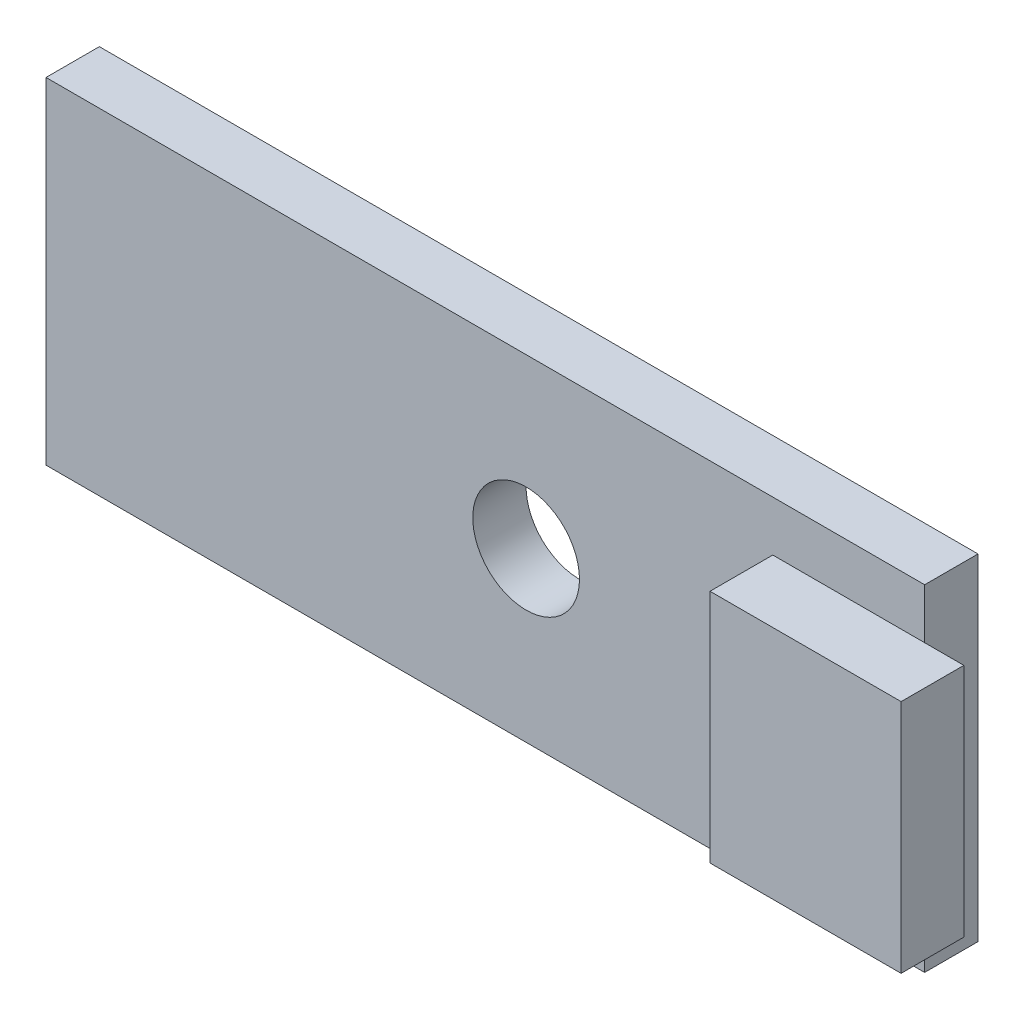
ISO-10303-21;
HEADER;
FILE_DESCRIPTION(('STEP AP214'),'2;1');
FILE_NAME('part.step','',(''),(''),'','','');
FILE_SCHEMA(('AUTOMOTIVE_DESIGN { 1 0 10303 214 1 1 1 1 }'));
ENDSEC;
DATA;
#1=APPLICATION_CONTEXT('core data for automotive mechanical design processes');
#2=APPLICATION_PROTOCOL_DEFINITION('international standard','automotive_design',2000,#1);
#3=PRODUCT_CONTEXT('',#1,'mechanical');
#4=PRODUCT('Part','Part','',(#3));
#5=PRODUCT_RELATED_PRODUCT_CATEGORY('part','',(#4));
#6=PRODUCT_DEFINITION_FORMATION('','',#4);
#7=PRODUCT_DEFINITION_CONTEXT('part definition',#1,'design');
#8=PRODUCT_DEFINITION('design','',#6,#7);
#9=PRODUCT_DEFINITION_SHAPE('','',#8);
#10=(LENGTH_UNIT() NAMED_UNIT(*) SI_UNIT(.MILLI.,.METRE.));
#11=(NAMED_UNIT(*) PLANE_ANGLE_UNIT() SI_UNIT($,.RADIAN.));
#12=(NAMED_UNIT(*) SI_UNIT($,.STERADIAN.) SOLID_ANGLE_UNIT());
#13=UNCERTAINTY_MEASURE_WITH_UNIT(LENGTH_MEASURE(1.E-05),#10,'distance_accuracy_value','');
#14=(GEOMETRIC_REPRESENTATION_CONTEXT(3) GLOBAL_UNCERTAINTY_ASSIGNED_CONTEXT((#13)) GLOBAL_UNIT_ASSIGNED_CONTEXT((#10,
#11,#12)) REPRESENTATION_CONTEXT('',''));
#15=CARTESIAN_POINT('',(0.,0.,0.));
#16=DIRECTION('',(0.,0.,1.));
#17=DIRECTION('',(1.,0.,0.));
#18=AXIS2_PLACEMENT_3D('',#15,#16,#17);
#19=CARTESIAN_POINT('',(0.,0.,1.7));
#20=DIRECTION('',(0.,0.,-1.));
#21=DIRECTION('',(-1.,0.,0.));
#22=AXIS2_PLACEMENT_3D('',#19,#20,#21);
#23=PLANE('',#22);
#24=CARTESIAN_POINT('',(1.29999999999997,0.,1.7));
#25=DIRECTION('',(0.,0.,1.));
#26=DIRECTION('',(1.,0.,0.));
#27=AXIS2_PLACEMENT_3D('',#24,#25,#26);
#28=CIRCLE('',#27,1.7);
#29=CARTESIAN_POINT('',(2.99999999999997,0.,1.7));
#30=VERTEX_POINT('',#29);
#31=EDGE_CURVE('E131',#30,#30,#28,.T.);
#32=ORIENTED_EDGE('',*,*,#31,.F.);
#33=EDGE_LOOP('',(#32));
#34=FACE_BOUND('',#33,.T.);
#35=DIRECTION('',(1.,0.,0.));
#36=VECTOR('',#35,1.);
#37=CARTESIAN_POINT('',(9.15999999999996,-3.75,1.7));
#38=LINE('',#37,#36);
#39=CARTESIAN_POINT('',(9.15999999999996,-3.75,1.7));
#40=VERTEX_POINT('',#39);
#41=CARTESIAN_POINT('',(14.,-3.75,1.7));
#42=VERTEX_POINT('',#41);
#43=EDGE_CURVE('E52',#40,#42,#38,.T.);
#44=ORIENTED_EDGE('',*,*,#43,.F.);
#45=DIRECTION('',(0.,-1.,0.));
#46=VECTOR('',#45,1.);
#47=CARTESIAN_POINT('',(9.15999999999996,-3.75,1.7));
#48=LINE('',#47,#46);
#49=CARTESIAN_POINT('',(9.15999999999996,3.75,1.7));
#50=VERTEX_POINT('',#49);
#51=EDGE_CURVE('E194',#50,#40,#48,.T.);
#52=ORIENTED_EDGE('',*,*,#51,.F.);
#53=DIRECTION('',(-1.,0.,0.));
#54=VECTOR('',#53,1.);
#55=CARTESIAN_POINT('',(9.15999999999996,3.75,1.7));
#56=LINE('',#55,#54);
#57=CARTESIAN_POINT('',(14.,3.75,1.7));
#58=VERTEX_POINT('',#57);
#59=EDGE_CURVE('E11',#58,#50,#56,.T.);
#60=ORIENTED_EDGE('',*,*,#59,.F.);
#61=DIRECTION('',(0.,1.,0.));
#62=VECTOR('',#61,1.);
#63=CARTESIAN_POINT('',(14.,-5.34999999999999,1.7));
#64=LINE('',#63,#62);
#65=CARTESIAN_POINT('',(14.,5.34999999999999,1.7));
#66=VERTEX_POINT('',#65);
#67=EDGE_CURVE('E147',#58,#66,#64,.T.);
#68=ORIENTED_EDGE('',*,*,#67,.T.);
#69=DIRECTION('',(-1.,0.,0.));
#70=VECTOR('',#69,1.);
#71=CARTESIAN_POINT('',(-14.,5.34999999999999,1.7));
#72=LINE('',#71,#70);
#73=CARTESIAN_POINT('',(-14.,5.34999999999999,1.7));
#74=VERTEX_POINT('',#73);
#75=EDGE_CURVE('E145',#66,#74,#72,.T.);
#76=ORIENTED_EDGE('',*,*,#75,.T.);
#77=DIRECTION('',(0.,-1.,0.));
#78=VECTOR('',#77,1.);
#79=CARTESIAN_POINT('',(-14.,-5.34999999999999,1.7));
#80=LINE('',#79,#78);
#81=CARTESIAN_POINT('',(-14.,-5.34999999999999,1.7));
#82=VERTEX_POINT('',#81);
#83=EDGE_CURVE('E149',#74,#82,#80,.T.);
#84=ORIENTED_EDGE('',*,*,#83,.T.);
#85=DIRECTION('',(1.,0.,0.));
#86=VECTOR('',#85,1.);
#87=CARTESIAN_POINT('',(-14.,-5.34999999999999,1.7));
#88=LINE('',#87,#86);
#89=CARTESIAN_POINT('',(14.,-5.34999999999999,1.7));
#90=VERTEX_POINT('',#89);
#91=EDGE_CURVE('E151',#82,#90,#88,.T.);
#92=ORIENTED_EDGE('',*,*,#91,.T.);
#93=EDGE_CURVE('E143',#90,#42,#64,.T.);
#94=ORIENTED_EDGE('',*,*,#93,.T.);
#95=EDGE_LOOP('',(#44,#52,#60,#68,#76,#84,#92,#94));
#96=FACE_BOUND('',#95,.T.);
#97=ADVANCED_FACE('F35',(#34,#96),#23,.F.);
#98=CARTESIAN_POINT('',(14.,-5.34999999999999,1.7));
#99=DIRECTION('',(-1.,0.,0.));
#100=DIRECTION('',(0.,0.,1.));
#101=AXIS2_PLACEMENT_3D('',#98,#99,#100);
#102=PLANE('',#101);
#103=DIRECTION('',(0.,1.,0.));
#104=VECTOR('',#103,1.);
#105=CARTESIAN_POINT('',(14.,-5.34999999999999,0.));
#106=LINE('',#105,#104);
#107=CARTESIAN_POINT('',(14.,-5.34999999999999,0.));
#108=VERTEX_POINT('',#107);
#109=CARTESIAN_POINT('',(14.,5.34999999999999,0.));
#110=VERTEX_POINT('',#109);
#111=EDGE_CURVE('E141',#108,#110,#106,.T.);
#112=ORIENTED_EDGE('',*,*,#111,.T.);
#113=DIRECTION('',(0.,0.,-1.));
#114=VECTOR('',#113,1.);
#115=CARTESIAN_POINT('',(14.,5.34999999999999,1.7));
#116=LINE('',#115,#114);
#117=EDGE_CURVE('E39',#66,#110,#116,.T.);
#118=ORIENTED_EDGE('',*,*,#117,.F.);
#119=ORIENTED_EDGE('',*,*,#67,.F.);
#120=EDGE_CURVE('E146',#42,#58,#64,.T.);
#121=ORIENTED_EDGE('',*,*,#120,.F.);
#122=ORIENTED_EDGE('',*,*,#93,.F.);
#123=DIRECTION('',(0.,0.,-1.));
#124=VECTOR('',#123,1.);
#125=CARTESIAN_POINT('',(14.,-5.34999999999999,1.7));
#126=LINE('',#125,#124);
#127=EDGE_CURVE('E153',#90,#108,#126,.T.);
#128=ORIENTED_EDGE('',*,*,#127,.T.);
#129=EDGE_LOOP('',(#112,#118,#119,#121,#122,#128));
#130=FACE_BOUND('',#129,.T.);
#131=ADVANCED_FACE('F37',(#130),#102,.F.);
#132=CARTESIAN_POINT('',(-14.,5.34999999999999,1.7));
#133=DIRECTION('',(0.,-1.,0.));
#134=DIRECTION('',(0.,0.,-1.));
#135=AXIS2_PLACEMENT_3D('',#132,#133,#134);
#136=PLANE('',#135);
#137=DIRECTION('',(-1.,0.,0.));
#138=VECTOR('',#137,1.);
#139=CARTESIAN_POINT('',(-14.,5.34999999999999,0.));
#140=LINE('',#139,#138);
#141=CARTESIAN_POINT('',(-14.,5.34999999999999,0.));
#142=VERTEX_POINT('',#141);
#143=EDGE_CURVE('E156',#110,#142,#140,.T.);
#144=ORIENTED_EDGE('',*,*,#143,.T.);
#145=DIRECTION('',(0.,0.,-1.));
#146=VECTOR('',#145,1.);
#147=CARTESIAN_POINT('',(-14.,5.34999999999999,1.7));
#148=LINE('',#147,#146);
#149=EDGE_CURVE('E166',#74,#142,#148,.T.);
#150=ORIENTED_EDGE('',*,*,#149,.F.);
#151=ORIENTED_EDGE('',*,*,#75,.F.);
#152=ORIENTED_EDGE('',*,*,#117,.T.);
#153=EDGE_LOOP('',(#144,#150,#151,#152));
#154=FACE_BOUND('',#153,.T.);
#155=ADVANCED_FACE('F176',(#154),#136,.F.);
#156=CARTESIAN_POINT('',(-14.,-5.34999999999999,1.7));
#157=DIRECTION('',(1.,0.,0.));
#158=DIRECTION('',(0.,0.,-1.));
#159=AXIS2_PLACEMENT_3D('',#156,#157,#158);
#160=PLANE('',#159);
#161=DIRECTION('',(0.,-1.,0.));
#162=VECTOR('',#161,1.);
#163=CARTESIAN_POINT('',(-14.,-5.34999999999999,0.));
#164=LINE('',#163,#162);
#165=CARTESIAN_POINT('',(-14.,-5.34999999999999,0.));
#166=VERTEX_POINT('',#165);
#167=EDGE_CURVE('E158',#142,#166,#164,.T.);
#168=ORIENTED_EDGE('',*,*,#167,.T.);
#169=DIRECTION('',(0.,0.,-1.));
#170=VECTOR('',#169,1.);
#171=CARTESIAN_POINT('',(-14.,-5.34999999999999,1.7));
#172=LINE('',#171,#170);
#173=EDGE_CURVE('E164',#82,#166,#172,.T.);
#174=ORIENTED_EDGE('',*,*,#173,.F.);
#175=ORIENTED_EDGE('',*,*,#83,.F.);
#176=ORIENTED_EDGE('',*,*,#149,.T.);
#177=EDGE_LOOP('',(#168,#174,#175,#176));
#178=FACE_BOUND('',#177,.T.);
#179=ADVANCED_FACE('F185',(#178),#160,.F.);
#180=CARTESIAN_POINT('',(-14.,-5.34999999999999,1.7));
#181=DIRECTION('',(0.,1.,0.));
#182=DIRECTION('',(0.,0.,1.));
#183=AXIS2_PLACEMENT_3D('',#180,#181,#182);
#184=PLANE('',#183);
#185=DIRECTION('',(1.,0.,0.));
#186=VECTOR('',#185,1.);
#187=CARTESIAN_POINT('',(-14.,-5.34999999999999,0.));
#188=LINE('',#187,#186);
#189=EDGE_CURVE('E160',#166,#108,#188,.T.);
#190=ORIENTED_EDGE('',*,*,#189,.T.);
#191=ORIENTED_EDGE('',*,*,#127,.F.);
#192=ORIENTED_EDGE('',*,*,#91,.F.);
#193=ORIENTED_EDGE('',*,*,#173,.T.);
#194=EDGE_LOOP('',(#190,#191,#192,#193));
#195=FACE_BOUND('',#194,.T.);
#196=ADVANCED_FACE('F188',(#195),#184,.F.);
#197=CARTESIAN_POINT('',(0.,0.,0.));
#198=DIRECTION('',(0.,0.,-1.));
#199=DIRECTION('',(-1.,0.,0.));
#200=AXIS2_PLACEMENT_3D('',#197,#198,#199);
#201=PLANE('',#200);
#202=CARTESIAN_POINT('',(1.29999999999997,0.,0.));
#203=DIRECTION('',(0.,0.,1.));
#204=DIRECTION('',(1.,0.,0.));
#205=AXIS2_PLACEMENT_3D('',#202,#203,#204);
#206=CIRCLE('',#205,1.7);
#207=CARTESIAN_POINT('',(2.99999999999997,0.,0.));
#208=VERTEX_POINT('',#207);
#209=EDGE_CURVE('E134',#208,#208,#206,.T.);
#210=ORIENTED_EDGE('',*,*,#209,.T.);
#211=EDGE_LOOP('',(#210));
#212=FACE_BOUND('',#211,.T.);
#213=ORIENTED_EDGE('',*,*,#111,.F.);
#214=ORIENTED_EDGE('',*,*,#189,.F.);
#215=ORIENTED_EDGE('',*,*,#167,.F.);
#216=ORIENTED_EDGE('',*,*,#143,.F.);
#217=EDGE_LOOP('',(#213,#214,#215,#216));
#218=FACE_BOUND('',#217,.T.);
#219=ADVANCED_FACE('F183',(#212,#218),#201,.T.);
#220=CARTESIAN_POINT('',(1.29999999999997,0.,0.));
#221=DIRECTION('',(0.,0.,1.));
#222=DIRECTION('',(1.,0.,0.));
#223=AXIS2_PLACEMENT_3D('',#220,#221,#222);
#224=CYLINDRICAL_SURFACE('',#223,1.7);
#225=ORIENTED_EDGE('',*,*,#209,.F.);
#226=EDGE_LOOP('',(#225));
#227=FACE_BOUND('',#226,.T.);
#228=ORIENTED_EDGE('',*,*,#31,.T.);
#229=EDGE_LOOP('',(#228));
#230=FACE_BOUND('',#229,.T.);
#231=ADVANCED_FACE('F225',(#227,#230),#224,.F.);
#232=CARTESIAN_POINT('',(15.25,-3.75,3.7));
#233=DIRECTION('',(-1.,0.,0.));
#234=DIRECTION('',(0.,0.,1.));
#235=AXIS2_PLACEMENT_3D('',#232,#233,#234);
#236=PLANE('',#235);
#237=DIRECTION('',(0.,1.,0.));
#238=VECTOR('',#237,1.);
#239=CARTESIAN_POINT('',(15.25,-3.75,1.7));
#240=LINE('',#239,#238);
#241=CARTESIAN_POINT('',(15.25,-3.75,1.7));
#242=VERTEX_POINT('',#241);
#243=CARTESIAN_POINT('',(15.25,3.75,1.7));
#244=VERTEX_POINT('',#243);
#245=EDGE_CURVE('E130',#242,#244,#240,.T.);
#246=ORIENTED_EDGE('',*,*,#245,.T.);
#247=DIRECTION('',(0.,0.,-1.));
#248=VECTOR('',#247,1.);
#249=CARTESIAN_POINT('',(15.25,3.75,3.7));
#250=LINE('',#249,#248);
#251=CARTESIAN_POINT('',(15.25,3.75,3.7));
#252=VERTEX_POINT('',#251);
#253=EDGE_CURVE('E111',#252,#244,#250,.T.);
#254=ORIENTED_EDGE('',*,*,#253,.F.);
#255=DIRECTION('',(0.,1.,0.));
#256=VECTOR('',#255,1.);
#257=CARTESIAN_POINT('',(15.25,-3.75,3.7));
#258=LINE('',#257,#256);
#259=CARTESIAN_POINT('',(15.25,-3.75,3.7));
#260=VERTEX_POINT('',#259);
#261=EDGE_CURVE('E118',#260,#252,#258,.T.);
#262=ORIENTED_EDGE('',*,*,#261,.F.);
#263=DIRECTION('',(0.,0.,-1.));
#264=VECTOR('',#263,1.);
#265=CARTESIAN_POINT('',(15.25,-3.75,3.7));
#266=LINE('',#265,#264);
#267=EDGE_CURVE('E200',#260,#242,#266,.T.);
#268=ORIENTED_EDGE('',*,*,#267,.T.);
#269=EDGE_LOOP('',(#246,#254,#262,#268));
#270=FACE_BOUND('',#269,.T.);
#271=ADVANCED_FACE('F128',(#270),#236,.F.);
#272=CARTESIAN_POINT('',(9.15999999999996,3.75,3.7));
#273=DIRECTION('',(0.,-1.,0.));
#274=DIRECTION('',(0.,0.,-1.));
#275=AXIS2_PLACEMENT_3D('',#272,#273,#274);
#276=PLANE('',#275);
#277=EDGE_CURVE('E45',#244,#58,#56,.T.);
#278=ORIENTED_EDGE('',*,*,#277,.T.);
#279=ORIENTED_EDGE('',*,*,#59,.T.);
#280=DIRECTION('',(0.,0.,-1.));
#281=VECTOR('',#280,1.);
#282=CARTESIAN_POINT('',(9.15999999999996,3.75,3.7));
#283=LINE('',#282,#281);
#284=CARTESIAN_POINT('',(9.15999999999996,3.75,3.7));
#285=VERTEX_POINT('',#284);
#286=EDGE_CURVE('E114',#285,#50,#283,.T.);
#287=ORIENTED_EDGE('',*,*,#286,.F.);
#288=DIRECTION('',(-1.,0.,0.));
#289=VECTOR('',#288,1.);
#290=CARTESIAN_POINT('',(9.15999999999996,3.75,3.7));
#291=LINE('',#290,#289);
#292=EDGE_CURVE('E106',#252,#285,#291,.T.);
#293=ORIENTED_EDGE('',*,*,#292,.F.);
#294=ORIENTED_EDGE('',*,*,#253,.T.);
#295=EDGE_LOOP('',(#278,#279,#287,#293,#294));
#296=FACE_BOUND('',#295,.T.);
#297=ADVANCED_FACE('F109',(#296),#276,.F.);
#298=CARTESIAN_POINT('',(9.15999999999996,-3.75,3.7));
#299=DIRECTION('',(1.,0.,0.));
#300=DIRECTION('',(0.,0.,-1.));
#301=AXIS2_PLACEMENT_3D('',#298,#299,#300);
#302=PLANE('',#301);
#303=ORIENTED_EDGE('',*,*,#51,.T.);
#304=DIRECTION('',(0.,0.,-1.));
#305=VECTOR('',#304,1.);
#306=CARTESIAN_POINT('',(9.15999999999996,-3.75,3.7));
#307=LINE('',#306,#305);
#308=CARTESIAN_POINT('',(9.15999999999996,-3.75,3.7));
#309=VERTEX_POINT('',#308);
#310=EDGE_CURVE('E136',#309,#40,#307,.T.);
#311=ORIENTED_EDGE('',*,*,#310,.F.);
#312=DIRECTION('',(0.,-1.,0.));
#313=VECTOR('',#312,1.);
#314=CARTESIAN_POINT('',(9.15999999999996,-3.75,3.7));
#315=LINE('',#314,#313);
#316=EDGE_CURVE('E117',#285,#309,#315,.T.);
#317=ORIENTED_EDGE('',*,*,#316,.F.);
#318=ORIENTED_EDGE('',*,*,#286,.T.);
#319=EDGE_LOOP('',(#303,#311,#317,#318));
#320=FACE_BOUND('',#319,.T.);
#321=ADVANCED_FACE('F206',(#320),#302,.F.);
#322=CARTESIAN_POINT('',(9.15999999999996,-3.75,3.7));
#323=DIRECTION('',(0.,1.,0.));
#324=DIRECTION('',(0.,0.,1.));
#325=AXIS2_PLACEMENT_3D('',#322,#323,#324);
#326=PLANE('',#325);
#327=ORIENTED_EDGE('',*,*,#43,.T.);
#328=EDGE_CURVE('E193',#42,#242,#38,.T.);
#329=ORIENTED_EDGE('',*,*,#328,.T.);
#330=ORIENTED_EDGE('',*,*,#267,.F.);
#331=DIRECTION('',(1.,0.,0.));
#332=VECTOR('',#331,1.);
#333=CARTESIAN_POINT('',(9.15999999999996,-3.75,3.7));
#334=LINE('',#333,#332);
#335=EDGE_CURVE('E123',#309,#260,#334,.T.);
#336=ORIENTED_EDGE('',*,*,#335,.F.);
#337=ORIENTED_EDGE('',*,*,#310,.T.);
#338=EDGE_LOOP('',(#327,#329,#330,#336,#337));
#339=FACE_BOUND('',#338,.T.);
#340=ADVANCED_FACE('F204',(#339),#326,.F.);
#341=CARTESIAN_POINT('',(0.,0.,3.7));
#342=DIRECTION('',(0.,0.,-1.));
#343=DIRECTION('',(-1.,0.,0.));
#344=AXIS2_PLACEMENT_3D('',#341,#342,#343);
#345=PLANE('',#344);
#346=ORIENTED_EDGE('',*,*,#261,.T.);
#347=ORIENTED_EDGE('',*,*,#292,.T.);
#348=ORIENTED_EDGE('',*,*,#316,.T.);
#349=ORIENTED_EDGE('',*,*,#335,.T.);
#350=EDGE_LOOP('',(#346,#347,#348,#349));
#351=FACE_BOUND('',#350,.T.);
#352=ADVANCED_FACE('F121',(#351),#345,.F.);
#353=CARTESIAN_POINT('',(0.,0.,1.7));
#354=DIRECTION('',(0.,0.,-1.));
#355=DIRECTION('',(-1.,0.,0.));
#356=AXIS2_PLACEMENT_3D('',#353,#354,#355);
#357=PLANE('',#356);
#358=ORIENTED_EDGE('',*,*,#328,.F.);
#359=ORIENTED_EDGE('',*,*,#120,.T.);
#360=ORIENTED_EDGE('',*,*,#277,.F.);
#361=ORIENTED_EDGE('',*,*,#245,.F.);
#362=EDGE_LOOP('',(#358,#359,#360,#361));
#363=FACE_BOUND('',#362,.T.);
#364=ADVANCED_FACE('F192',(#363),#357,.T.);
#365=CLOSED_SHELL('',(#97,#131,#155,#179,#196,#219,#231,#271,#297,#321,#340,#352,#364));
#366=MANIFOLD_SOLID_BREP('B2',#365);
#367=ADVANCED_BREP_SHAPE_REPRESENTATION('',(#18,#366),#14);
#368=SHAPE_DEFINITION_REPRESENTATION(#9,#367);
ENDSEC;
END-ISO-10303-21;
